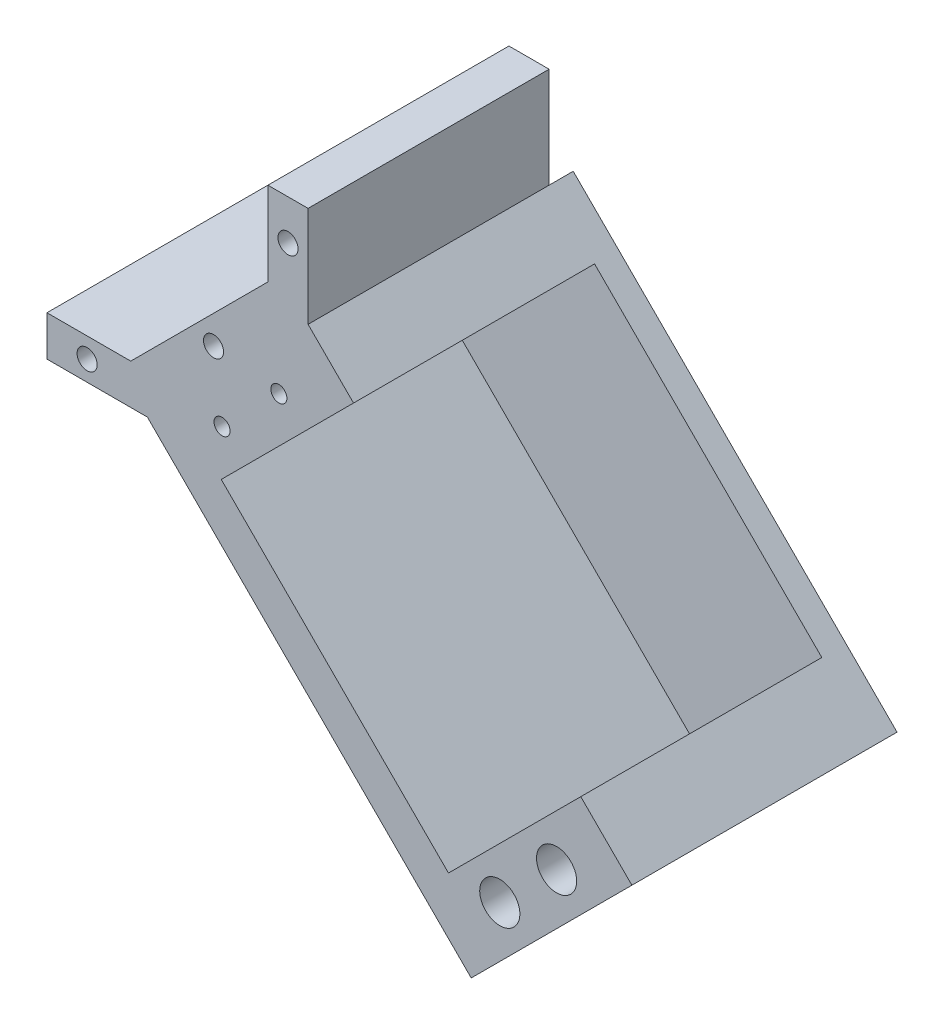
ISO-10303-21;
HEADER;
FILE_DESCRIPTION(('STEP AP214'),'2;1');
FILE_NAME('part.step','',(''),(''),'','','');
FILE_SCHEMA(('AUTOMOTIVE_DESIGN { 1 0 10303 214 1 1 1 1 }'));
ENDSEC;
DATA;
#1=APPLICATION_CONTEXT('core data for automotive mechanical design processes');
#2=APPLICATION_PROTOCOL_DEFINITION('international standard','automotive_design',2000,#1);
#3=PRODUCT_CONTEXT('',#1,'mechanical');
#4=PRODUCT('Part','Part','',(#3));
#5=PRODUCT_RELATED_PRODUCT_CATEGORY('part','',(#4));
#6=PRODUCT_DEFINITION_FORMATION('','',#4);
#7=PRODUCT_DEFINITION_CONTEXT('part definition',#1,'design');
#8=PRODUCT_DEFINITION('design','',#6,#7);
#9=PRODUCT_DEFINITION_SHAPE('','',#8);
#10=(LENGTH_UNIT() NAMED_UNIT(*) SI_UNIT(.MILLI.,.METRE.));
#11=(NAMED_UNIT(*) PLANE_ANGLE_UNIT() SI_UNIT($,.RADIAN.));
#12=(NAMED_UNIT(*) SI_UNIT($,.STERADIAN.) SOLID_ANGLE_UNIT());
#13=UNCERTAINTY_MEASURE_WITH_UNIT(LENGTH_MEASURE(1.E-05),#10,'distance_accuracy_value','');
#14=(GEOMETRIC_REPRESENTATION_CONTEXT(3) GLOBAL_UNCERTAINTY_ASSIGNED_CONTEXT((#13)) GLOBAL_UNIT_ASSIGNED_CONTEXT((#10,
#11,#12)) REPRESENTATION_CONTEXT('',''));
#15=CARTESIAN_POINT('',(0.,0.,0.));
#16=DIRECTION('',(0.,0.,1.));
#17=DIRECTION('',(1.,0.,0.));
#18=AXIS2_PLACEMENT_3D('',#15,#16,#17);
#19=CARTESIAN_POINT('',(0.,0.,0.));
#20=DIRECTION('',(0.,0.,1.));
#21=DIRECTION('',(1.,0.,0.));
#22=AXIS2_PLACEMENT_3D('',#19,#20,#21);
#23=PLANE('',#22);
#24=CARTESIAN_POINT('',(17.6006949622462,12.8343271996086,0.));
#25=DIRECTION('',(0.,0.,1.));
#26=DIRECTION('',(1.,0.,0.));
#27=AXIS2_PLACEMENT_3D('',#24,#25,#26);
#28=CIRCLE('',#27,1.25);
#29=CARTESIAN_POINT('',(18.8506949622462,12.8343271996086,0.));
#30=VERTEX_POINT('',#29);
#31=EDGE_CURVE('E177',#30,#30,#28,.T.);
#32=ORIENTED_EDGE('',*,*,#31,.T.);
#33=EDGE_LOOP('',(#32));
#34=FACE_BOUND('',#33,.T.);
#35=CARTESIAN_POINT('',(42.6006949622462,37.8343271996086,0.));
#36=DIRECTION('',(0.,0.,1.));
#37=DIRECTION('',(1.,0.,0.));
#38=AXIS2_PLACEMENT_3D('',#35,#36,#37);
#39=CIRCLE('',#38,1.25);
#40=CARTESIAN_POINT('',(43.8506949622462,37.8343271996086,0.));
#41=VERTEX_POINT('',#40);
#42=EDGE_CURVE('E174',#41,#41,#39,.T.);
#43=ORIENTED_EDGE('',*,*,#42,.T.);
#44=EDGE_LOOP('',(#43));
#45=FACE_BOUND('',#44,.T.);
#46=CARTESIAN_POINT('',(33.3329280092798,22.102094152575,0.));
#47=DIRECTION('',(0.,0.,1.));
#48=DIRECTION('',(1.,0.,0.));
#49=AXIS2_PLACEMENT_3D('',#46,#47,#48);
#50=CIRCLE('',#49,1.25);
#51=CARTESIAN_POINT('',(34.5829280092798,22.102094152575,0.));
#52=VERTEX_POINT('',#51);
#53=EDGE_CURVE('E171',#52,#52,#50,.T.);
#54=ORIENTED_EDGE('',*,*,#53,.T.);
#55=EDGE_LOOP('',(#54));
#56=FACE_BOUND('',#55,.T.);
#57=DIRECTION('',(0.707106781186548,0.707106781186548,0.));
#58=VECTOR('',#57,1.);
#59=CARTESIAN_POINT('',(45.1006949622462,30.3343271996086,0.));
#60=LINE('',#59,#58);
#61=CARTESIAN_POINT('',(25.1006949622462,10.3343271996086,0.));
#62=VERTEX_POINT('',#61);
#63=CARTESIAN_POINT('',(45.1006949622462,30.3343271996086,0.));
#64=VERTEX_POINT('',#63);
#65=EDGE_CURVE('E91',#62,#64,#60,.T.);
#66=ORIENTED_EDGE('',*,*,#65,.F.);
#67=DIRECTION('',(-1.,0.,0.));
#68=VECTOR('',#67,1.);
#69=CARTESIAN_POINT('',(0.,10.3343271996086,0.));
#70=LINE('',#69,#68);
#71=CARTESIAN_POINT('',(12.6006949622462,10.3343271996086,0.));
#72=VERTEX_POINT('',#71);
#73=EDGE_CURVE('E169',#62,#72,#70,.T.);
#74=ORIENTED_EDGE('',*,*,#73,.T.);
#75=DIRECTION('',(0.,1.,0.));
#76=VECTOR('',#75,1.);
#77=CARTESIAN_POINT('',(12.6006949622461,0.,0.));
#78=LINE('',#77,#76);
#79=CARTESIAN_POINT('',(12.6006949622462,15.3343271996086,0.));
#80=VERTEX_POINT('',#79);
#81=EDGE_CURVE('E121',#72,#80,#78,.T.);
#82=ORIENTED_EDGE('',*,*,#81,.T.);
#83=DIRECTION('',(-1.,0.,0.));
#84=VECTOR('',#83,1.);
#85=CARTESIAN_POINT('',(0.,15.3343271996086,0.));
#86=LINE('',#85,#84);
#87=CARTESIAN_POINT('',(23.0296271503807,15.3343271996086,0.));
#88=VERTEX_POINT('',#87);
#89=EDGE_CURVE('E165',#88,#80,#86,.T.);
#90=ORIENTED_EDGE('',*,*,#89,.F.);
#91=DIRECTION('',(0.707106781186548,0.707106781186547,0.));
#92=VECTOR('',#91,1.);
#93=CARTESIAN_POINT('',(3.84764997538603,-3.84764997538603,0.));
#94=LINE('',#93,#92);
#95=CARTESIAN_POINT('',(40.1006949622462,32.4053950114741,0.));
#96=VERTEX_POINT('',#95);
#97=EDGE_CURVE('E162',#88,#96,#94,.T.);
#98=ORIENTED_EDGE('',*,*,#97,.T.);
#99=DIRECTION('',(0.,-1.,0.));
#100=VECTOR('',#99,1.);
#101=CARTESIAN_POINT('',(40.1006949622462,0.,0.));
#102=LINE('',#101,#100);
#103=CARTESIAN_POINT('',(40.1006949622462,42.8343271996086,0.));
#104=VERTEX_POINT('',#103);
#105=EDGE_CURVE('E159',#104,#96,#102,.T.);
#106=ORIENTED_EDGE('',*,*,#105,.F.);
#107=DIRECTION('',(1.,0.,0.));
#108=VECTOR('',#107,1.);
#109=CARTESIAN_POINT('',(0.,42.8343271996086,0.));
#110=LINE('',#109,#108);
#111=CARTESIAN_POINT('',(45.1006949622462,42.8343271996086,0.));
#112=VERTEX_POINT('',#111);
#113=EDGE_CURVE('E155',#104,#112,#110,.T.);
#114=ORIENTED_EDGE('',*,*,#113,.T.);
#115=DIRECTION('',(0.,-1.,0.));
#116=VECTOR('',#115,1.);
#117=CARTESIAN_POINT('',(45.1006949622462,0.,0.));
#118=LINE('',#117,#116);
#119=EDGE_CURVE('E153',#112,#64,#118,.T.);
#120=ORIENTED_EDGE('',*,*,#119,.T.);
#121=EDGE_LOOP('',(#66,#74,#82,#90,#98,#106,#114,#120));
#122=FACE_BOUND('',#121,.T.);
#123=ADVANCED_FACE('F38',(#34,#45,#56,#122),#23,.F.);
#124=CARTESIAN_POINT('',(37.7175110809274,37.7175110809274,30.));
#125=DIRECTION('',(0.707106781186548,0.707106781186547,0.));
#126=DIRECTION('',(-0.707106781186547,0.707106781186548,0.));
#127=AXIS2_PLACEMENT_3D('',#124,#125,#126);
#128=PLANE('',#127);
#129=DIRECTION('',(0.,0.,-1.));
#130=VECTOR('',#129,1.);
#131=CARTESIAN_POINT('',(50.7575492117385,24.6774729501163,30.));
#132=LINE('',#131,#130);
#133=CARTESIAN_POINT('',(50.7575492117385,24.6774729501163,30.));
#134=VERTEX_POINT('',#133);
#135=CARTESIAN_POINT('',(50.7575492117385,24.6774729501163,0.));
#136=VERTEX_POINT('',#135);
#137=EDGE_CURVE('E152',#134,#136,#132,.T.);
#138=ORIENTED_EDGE('',*,*,#137,.T.);
#139=DIRECTION('',(0.707106781186547,-0.707106781186548,0.));
#140=VECTOR('',#139,1.);
#141=CARTESIAN_POINT('',(79.0418204592004,-3.60679829734566,0.));
#142=LINE('',#141,#140);
#143=CARTESIAN_POINT('',(79.0418204592004,-3.60679829734566,0.));
#144=VERTEX_POINT('',#143);
#145=EDGE_CURVE('E282',#136,#144,#142,.T.);
#146=ORIENTED_EDGE('',*,*,#145,.T.);
#147=DIRECTION('',(0.,0.,-1.));
#148=VECTOR('',#147,1.);
#149=CARTESIAN_POINT('',(79.0418204592004,-3.60679829734566,30.));
#150=LINE('',#149,#148);
#151=CARTESIAN_POINT('',(79.0418204592004,-3.60679829734566,30.));
#152=VERTEX_POINT('',#151);
#153=EDGE_CURVE('E264',#152,#144,#150,.T.);
#154=ORIENTED_EDGE('',*,*,#153,.F.);
#155=DIRECTION('',(0.707106781186548,-0.707106781186547,0.));
#156=VECTOR('',#155,1.);
#157=CARTESIAN_POINT('',(85.4057814898793,-9.97075932802457,30.));
#158=LINE('',#157,#156);
#159=CARTESIAN_POINT('',(85.4057814898793,-9.97075932802457,30.));
#160=VERTEX_POINT('',#159);
#161=EDGE_CURVE('E252',#152,#160,#158,.T.);
#162=ORIENTED_EDGE('',*,*,#161,.T.);
#163=DIRECTION('',(0.,0.,-1.));
#164=VECTOR('',#163,1.);
#165=CARTESIAN_POINT('',(85.4057814898793,-9.97075932802457,30.));
#166=LINE('',#165,#164);
#167=CARTESIAN_POINT('',(85.4057814898793,-9.97075932802457,-3.));
#168=VERTEX_POINT('',#167);
#169=EDGE_CURVE('E261',#160,#168,#166,.T.);
#170=ORIENTED_EDGE('',*,*,#169,.T.);
#171=DIRECTION('',(0.707106781186547,-0.707106781186547,0.));
#172=VECTOR('',#171,1.);
#173=CARTESIAN_POINT('',(45.1006949622462,30.3343271996086,-3.));
#174=LINE('',#173,#172);
#175=CARTESIAN_POINT('',(45.1006949622462,30.3343271996086,-3.));
#176=VERTEX_POINT('',#175);
#177=EDGE_CURVE('E313',#176,#168,#174,.T.);
#178=ORIENTED_EDGE('',*,*,#177,.F.);
#179=DIRECTION('',(0.,0.,1.));
#180=VECTOR('',#179,1.);
#181=CARTESIAN_POINT('',(45.1006949622462,30.3343271996086,-3.));
#182=LINE('',#181,#180);
#183=EDGE_CURVE('E236',#176,#64,#182,.T.);
#184=ORIENTED_EDGE('',*,*,#183,.T.);
#185=DIRECTION('',(0.,0.,-1.));
#186=VECTOR('',#185,1.);
#187=CARTESIAN_POINT('',(45.1006949622462,30.3343271996086,30.));
#188=LINE('',#187,#186);
#189=CARTESIAN_POINT('',(45.1006949622462,30.3343271996086,30.));
#190=VERTEX_POINT('',#189);
#191=EDGE_CURVE('E11',#190,#64,#188,.T.);
#192=ORIENTED_EDGE('',*,*,#191,.F.);
#193=DIRECTION('',(0.707106781186547,-0.707106781186548,0.));
#194=VECTOR('',#193,1.);
#195=CARTESIAN_POINT('',(37.7175110809274,37.7175110809274,30.));
#196=LINE('',#195,#194);
#197=EDGE_CURVE('E215',#190,#134,#196,.T.);
#198=ORIENTED_EDGE('',*,*,#197,.T.);
#199=EDGE_LOOP('',(#138,#146,#154,#162,#170,#178,#184,#192,#198));
#200=FACE_BOUND('',#199,.T.);
#201=ADVANCED_FACE('F276',(#200),#128,.T.);
#202=CARTESIAN_POINT('',(45.1006949622462,0.,30.));
#203=DIRECTION('',(1.,0.,0.));
#204=DIRECTION('',(0.,0.,-1.));
#205=AXIS2_PLACEMENT_3D('',#202,#203,#204);
#206=PLANE('',#205);
#207=ORIENTED_EDGE('',*,*,#119,.F.);
#208=DIRECTION('',(0.,0.,-1.));
#209=VECTOR('',#208,1.);
#210=CARTESIAN_POINT('',(45.1006949622462,42.8343271996086,30.));
#211=LINE('',#210,#209);
#212=CARTESIAN_POINT('',(45.1006949622462,42.8343271996086,30.));
#213=VERTEX_POINT('',#212);
#214=EDGE_CURVE('E47',#213,#112,#211,.T.);
#215=ORIENTED_EDGE('',*,*,#214,.F.);
#216=DIRECTION('',(0.,-1.,0.));
#217=VECTOR('',#216,1.);
#218=CARTESIAN_POINT('',(45.1006949622462,0.,30.));
#219=LINE('',#218,#217);
#220=EDGE_CURVE('E213',#213,#190,#219,.T.);
#221=ORIENTED_EDGE('',*,*,#220,.T.);
#222=ORIENTED_EDGE('',*,*,#191,.T.);
#223=EDGE_LOOP('',(#207,#215,#221,#222));
#224=FACE_BOUND('',#223,.T.);
#225=ADVANCED_FACE('F200',(#224),#206,.T.);
#226=CARTESIAN_POINT('',(0.,42.8343271996086,30.));
#227=DIRECTION('',(0.,1.,0.));
#228=DIRECTION('',(0.,0.,1.));
#229=AXIS2_PLACEMENT_3D('',#226,#227,#228);
#230=PLANE('',#229);
#231=ORIENTED_EDGE('',*,*,#113,.F.);
#232=DIRECTION('',(0.,0.,-1.));
#233=VECTOR('',#232,1.);
#234=CARTESIAN_POINT('',(40.1006949622462,42.8343271996086,30.));
#235=LINE('',#234,#233);
#236=CARTESIAN_POINT('',(40.1006949622462,42.8343271996086,30.));
#237=VERTEX_POINT('',#236);
#238=EDGE_CURVE('E189',#237,#104,#235,.T.);
#239=ORIENTED_EDGE('',*,*,#238,.F.);
#240=DIRECTION('',(1.,0.,0.));
#241=VECTOR('',#240,1.);
#242=CARTESIAN_POINT('',(0.,42.8343271996086,30.));
#243=LINE('',#242,#241);
#244=EDGE_CURVE('E196',#237,#213,#243,.T.);
#245=ORIENTED_EDGE('',*,*,#244,.T.);
#246=ORIENTED_EDGE('',*,*,#214,.T.);
#247=EDGE_LOOP('',(#231,#239,#245,#246));
#248=FACE_BOUND('',#247,.T.);
#249=ADVANCED_FACE('F194',(#248),#230,.T.);
#250=CARTESIAN_POINT('',(40.1006949622462,0.,30.));
#251=DIRECTION('',(1.,0.,0.));
#252=DIRECTION('',(0.,0.,-1.));
#253=AXIS2_PLACEMENT_3D('',#250,#251,#252);
#254=PLANE('',#253);
#255=ORIENTED_EDGE('',*,*,#105,.T.);
#256=DIRECTION('',(0.,0.,-1.));
#257=VECTOR('',#256,1.);
#258=CARTESIAN_POINT('',(40.1006949622462,32.4053950114741,30.));
#259=LINE('',#258,#257);
#260=CARTESIAN_POINT('',(40.1006949622462,32.4053950114741,30.));
#261=VERTEX_POINT('',#260);
#262=EDGE_CURVE('E187',#261,#96,#259,.T.);
#263=ORIENTED_EDGE('',*,*,#262,.F.);
#264=DIRECTION('',(0.,-1.,0.));
#265=VECTOR('',#264,1.);
#266=CARTESIAN_POINT('',(40.1006949622462,0.,30.));
#267=LINE('',#266,#265);
#268=EDGE_CURVE('E210',#237,#261,#267,.T.);
#269=ORIENTED_EDGE('',*,*,#268,.F.);
#270=ORIENTED_EDGE('',*,*,#238,.T.);
#271=EDGE_LOOP('',(#255,#263,#269,#270));
#272=FACE_BOUND('',#271,.T.);
#273=ADVANCED_FACE('F207',(#272),#254,.F.);
#274=CARTESIAN_POINT('',(3.84764997538603,-3.84764997538603,30.));
#275=DIRECTION('',(-0.707106781186547,0.707106781186548,0.));
#276=DIRECTION('',(-0.707106781186548,-0.707106781186547,0.));
#277=AXIS2_PLACEMENT_3D('',#274,#275,#276);
#278=PLANE('',#277);
#279=ORIENTED_EDGE('',*,*,#97,.F.);
#280=DIRECTION('',(0.,0.,-1.));
#281=VECTOR('',#280,1.);
#282=CARTESIAN_POINT('',(23.0296271503807,15.3343271996086,30.));
#283=LINE('',#282,#281);
#284=CARTESIAN_POINT('',(23.0296271503807,15.3343271996086,30.));
#285=VERTEX_POINT('',#284);
#286=EDGE_CURVE('E185',#285,#88,#283,.T.);
#287=ORIENTED_EDGE('',*,*,#286,.F.);
#288=DIRECTION('',(0.707106781186548,0.707106781186547,0.));
#289=VECTOR('',#288,1.);
#290=CARTESIAN_POINT('',(3.84764997538603,-3.84764997538603,30.));
#291=LINE('',#290,#289);
#292=EDGE_CURVE('E211',#285,#261,#291,.T.);
#293=ORIENTED_EDGE('',*,*,#292,.T.);
#294=ORIENTED_EDGE('',*,*,#262,.T.);
#295=EDGE_LOOP('',(#279,#287,#293,#294));
#296=FACE_BOUND('',#295,.T.);
#297=ADVANCED_FACE('F220',(#296),#278,.T.);
#298=CARTESIAN_POINT('',(0.,15.3343271996086,30.));
#299=DIRECTION('',(0.,-1.,0.));
#300=DIRECTION('',(1.,0.,0.));
#301=AXIS2_PLACEMENT_3D('',#298,#299,#300);
#302=PLANE('',#301);
#303=ORIENTED_EDGE('',*,*,#89,.T.);
#304=DIRECTION('',(0.,0.,-1.));
#305=VECTOR('',#304,1.);
#306=CARTESIAN_POINT('',(12.6006949622462,15.3343271996086,30.));
#307=LINE('',#306,#305);
#308=CARTESIAN_POINT('',(12.6006949622462,15.3343271996086,30.));
#309=VERTEX_POINT('',#308);
#310=EDGE_CURVE('E122',#309,#80,#307,.T.);
#311=ORIENTED_EDGE('',*,*,#310,.F.);
#312=DIRECTION('',(-1.,0.,0.));
#313=VECTOR('',#312,1.);
#314=CARTESIAN_POINT('',(0.,15.3343271996086,30.));
#315=LINE('',#314,#313);
#316=EDGE_CURVE('E132',#285,#309,#315,.T.);
#317=ORIENTED_EDGE('',*,*,#316,.F.);
#318=ORIENTED_EDGE('',*,*,#286,.T.);
#319=EDGE_LOOP('',(#303,#311,#317,#318));
#320=FACE_BOUND('',#319,.T.);
#321=ADVANCED_FACE('F222',(#320),#302,.F.);
#322=CARTESIAN_POINT('',(12.6006949622461,0.,30.));
#323=DIRECTION('',(-1.,0.,0.));
#324=DIRECTION('',(0.,-1.,0.));
#325=AXIS2_PLACEMENT_3D('',#322,#323,#324);
#326=PLANE('',#325);
#327=ORIENTED_EDGE('',*,*,#81,.F.);
#328=DIRECTION('',(0.,0.,-1.));
#329=VECTOR('',#328,1.);
#330=CARTESIAN_POINT('',(12.6006949622462,10.3343271996086,30.));
#331=LINE('',#330,#329);
#332=CARTESIAN_POINT('',(12.6006949622462,10.3343271996086,30.));
#333=VERTEX_POINT('',#332);
#334=EDGE_CURVE('E83',#333,#72,#331,.T.);
#335=ORIENTED_EDGE('',*,*,#334,.F.);
#336=DIRECTION('',(0.,1.,0.));
#337=VECTOR('',#336,1.);
#338=CARTESIAN_POINT('',(12.6006949622461,0.,30.));
#339=LINE('',#338,#337);
#340=EDGE_CURVE('E119',#333,#309,#339,.T.);
#341=ORIENTED_EDGE('',*,*,#340,.T.);
#342=ORIENTED_EDGE('',*,*,#310,.T.);
#343=EDGE_LOOP('',(#327,#335,#341,#342));
#344=FACE_BOUND('',#343,.T.);
#345=ADVANCED_FACE('F118',(#344),#326,.T.);
#346=CARTESIAN_POINT('',(0.,10.3343271996086,30.));
#347=DIRECTION('',(0.,-1.,0.));
#348=DIRECTION('',(0.,0.,-1.));
#349=AXIS2_PLACEMENT_3D('',#346,#347,#348);
#350=PLANE('',#349);
#351=ORIENTED_EDGE('',*,*,#73,.F.);
#352=DIRECTION('',(0.,0.,-1.));
#353=VECTOR('',#352,1.);
#354=CARTESIAN_POINT('',(25.1006949622462,10.3343271996086,30.));
#355=LINE('',#354,#353);
#356=CARTESIAN_POINT('',(25.1006949622462,10.3343271996086,30.));
#357=VERTEX_POINT('',#356);
#358=EDGE_CURVE('E123',#357,#62,#355,.T.);
#359=ORIENTED_EDGE('',*,*,#358,.F.);
#360=DIRECTION('',(-1.,0.,0.));
#361=VECTOR('',#360,1.);
#362=CARTESIAN_POINT('',(0.,10.3343271996086,30.));
#363=LINE('',#362,#361);
#364=EDGE_CURVE('E129',#357,#333,#363,.T.);
#365=ORIENTED_EDGE('',*,*,#364,.T.);
#366=ORIENTED_EDGE('',*,*,#334,.T.);
#367=EDGE_LOOP('',(#351,#359,#365,#366));
#368=FACE_BOUND('',#367,.T.);
#369=ADVANCED_FACE('F135',(#368),#350,.T.);
#370=CARTESIAN_POINT('',(17.7175110809275,17.7175110809274,30.));
#371=DIRECTION('',(0.70710678118655,0.707106781186545,0.));
#372=DIRECTION('',(-0.707106781186545,0.70710678118655,0.));
#373=AXIS2_PLACEMENT_3D('',#370,#371,#372);
#374=PLANE('',#373);
#375=ORIENTED_EDGE('',*,*,#358,.T.);
#376=DIRECTION('',(0.,0.,1.));
#377=VECTOR('',#376,1.);
#378=CARTESIAN_POINT('',(25.1006949622462,10.3343271996086,-3.));
#379=LINE('',#378,#377);
#380=CARTESIAN_POINT('',(25.1006949622462,10.3343271996086,-3.));
#381=VERTEX_POINT('',#380);
#382=EDGE_CURVE('E227',#381,#62,#379,.T.);
#383=ORIENTED_EDGE('',*,*,#382,.F.);
#384=DIRECTION('',(-0.707106781186547,0.707106781186548,0.));
#385=VECTOR('',#384,1.);
#386=CARTESIAN_POINT('',(65.4057814898793,-29.9707593280246,-3.));
#387=LINE('',#386,#385);
#388=CARTESIAN_POINT('',(65.4057814898793,-29.9707593280246,-3.));
#389=VERTEX_POINT('',#388);
#390=EDGE_CURVE('E319',#389,#381,#387,.T.);
#391=ORIENTED_EDGE('',*,*,#390,.F.);
#392=DIRECTION('',(0.,0.,-1.));
#393=VECTOR('',#392,1.);
#394=CARTESIAN_POINT('',(65.4057814898793,-29.9707593280246,30.));
#395=LINE('',#394,#393);
#396=CARTESIAN_POINT('',(65.4057814898793,-29.9707593280246,30.));
#397=VERTEX_POINT('',#396);
#398=EDGE_CURVE('E156',#397,#389,#395,.T.);
#399=ORIENTED_EDGE('',*,*,#398,.F.);
#400=DIRECTION('',(0.707106781186545,-0.70710678118655,0.));
#401=VECTOR('',#400,1.);
#402=CARTESIAN_POINT('',(17.7175110809275,17.7175110809274,30.));
#403=LINE('',#402,#401);
#404=EDGE_CURVE('E137',#357,#397,#403,.T.);
#405=ORIENTED_EDGE('',*,*,#404,.F.);
#406=EDGE_LOOP('',(#375,#383,#391,#399,#405));
#407=FACE_BOUND('',#406,.T.);
#408=ADVANCED_FACE('F340',(#407),#374,.F.);
#409=CARTESIAN_POINT('',(42.6006949622462,37.8343271996086,30.));
#410=DIRECTION('',(0.,0.,-1.));
#411=DIRECTION('',(-1.,0.,0.));
#412=AXIS2_PLACEMENT_3D('',#409,#410,#411);
#413=CYLINDRICAL_SURFACE('',#412,1.25);
#414=CARTESIAN_POINT('',(42.6006949622462,37.8343271996086,30.));
#415=DIRECTION('',(0.,0.,1.));
#416=DIRECTION('',(1.,0.,0.));
#417=AXIS2_PLACEMENT_3D('',#414,#415,#416);
#418=CIRCLE('',#417,1.25);
#419=CARTESIAN_POINT('',(43.8506949622462,37.8343271996086,30.));
#420=VERTEX_POINT('',#419);
#421=EDGE_CURVE('E146',#420,#420,#418,.T.);
#422=ORIENTED_EDGE('',*,*,#421,.T.);
#423=EDGE_LOOP('',(#422));
#424=FACE_BOUND('',#423,.T.);
#425=ORIENTED_EDGE('',*,*,#42,.F.);
#426=EDGE_LOOP('',(#425));
#427=FACE_BOUND('',#426,.T.);
#428=ADVANCED_FACE('F387',(#424,#427),#413,.F.);
#429=CARTESIAN_POINT('',(33.3329280092798,22.102094152575,30.));
#430=DIRECTION('',(0.,0.,-1.));
#431=DIRECTION('',(-1.,0.,0.));
#432=AXIS2_PLACEMENT_3D('',#429,#430,#431);
#433=CYLINDRICAL_SURFACE('',#432,1.25);
#434=CARTESIAN_POINT('',(33.3329280092798,22.102094152575,30.));
#435=DIRECTION('',(0.,0.,1.));
#436=DIRECTION('',(1.,0.,0.));
#437=AXIS2_PLACEMENT_3D('',#434,#435,#436);
#438=CIRCLE('',#437,1.25);
#439=CARTESIAN_POINT('',(34.5829280092798,22.102094152575,30.));
#440=VERTEX_POINT('',#439);
#441=EDGE_CURVE('E143',#440,#440,#438,.T.);
#442=ORIENTED_EDGE('',*,*,#441,.T.);
#443=EDGE_LOOP('',(#442));
#444=FACE_BOUND('',#443,.T.);
#445=ORIENTED_EDGE('',*,*,#53,.F.);
#446=EDGE_LOOP('',(#445));
#447=FACE_BOUND('',#446,.T.);
#448=ADVANCED_FACE('F390',(#444,#447),#433,.F.);
#449=CARTESIAN_POINT('',(13.0400381308111,-13.0400381308111,30.));
#450=DIRECTION('',(-0.707106781186547,0.707106781186548,0.));
#451=DIRECTION('',(-0.707106781186548,-0.707106781186547,0.));
#452=AXIS2_PLACEMENT_3D('',#449,#450,#451);
#453=PLANE('',#452);
#454=DIRECTION('',(0.,0.,-1.));
#455=VECTOR('',#454,1.);
#456=CARTESIAN_POINT('',(34.2930831176712,8.213006856049,30.));
#457=LINE('',#456,#455);
#458=CARTESIAN_POINT('',(34.2930831176712,8.213006856049,30.));
#459=VERTEX_POINT('',#458);
#460=CARTESIAN_POINT('',(34.2930831176712,8.213006856049,0.));
#461=VERTEX_POINT('',#460);
#462=EDGE_CURVE('E258',#459,#461,#457,.T.);
#463=ORIENTED_EDGE('',*,*,#462,.T.);
#464=DIRECTION('',(0.707106781186548,0.707106781186547,0.));
#465=VECTOR('',#464,1.);
#466=CARTESIAN_POINT('',(50.7575492117385,24.6774729501163,0.));
#467=LINE('',#466,#465);
#468=EDGE_CURVE('E290',#461,#136,#467,.T.);
#469=ORIENTED_EDGE('',*,*,#468,.T.);
#470=ORIENTED_EDGE('',*,*,#137,.F.);
#471=DIRECTION('',(0.707106781186548,0.707106781186547,0.));
#472=VECTOR('',#471,1.);
#473=CARTESIAN_POINT('',(13.0400381308111,-13.0400381308111,30.));
#474=LINE('',#473,#472);
#475=EDGE_CURVE('E55',#459,#134,#474,.T.);
#476=ORIENTED_EDGE('',*,*,#475,.F.);
#477=EDGE_LOOP('',(#463,#469,#470,#476));
#478=FACE_BOUND('',#477,.T.);
#479=ADVANCED_FACE('F287',(#478),#453,.F.);
#480=CARTESIAN_POINT('',(34.3935881810596,13.9703661689297,30.));
#481=DIRECTION('',(0.,0.,-1.));
#482=DIRECTION('',(-1.,0.,0.));
#483=AXIS2_PLACEMENT_3D('',#480,#481,#482);
#484=CYLINDRICAL_SURFACE('',#483,1.);
#485=CARTESIAN_POINT('',(34.3935881810596,13.9703661689297,30.));
#486=DIRECTION('',(0.,0.,1.));
#487=DIRECTION('',(1.,0.,0.));
#488=AXIS2_PLACEMENT_3D('',#485,#486,#487);
#489=CIRCLE('',#488,1.);
#490=CARTESIAN_POINT('',(35.3935881810596,13.9703661689297,30.));
#491=VERTEX_POINT('',#490);
#492=EDGE_CURVE('E274',#491,#491,#489,.T.);
#493=ORIENTED_EDGE('',*,*,#492,.T.);
#494=EDGE_LOOP('',(#493));
#495=FACE_BOUND('',#494,.T.);
#496=CARTESIAN_POINT('',(34.3935881810596,13.9703661689297,-3.));
#497=DIRECTION('',(0.,0.,-1.));
#498=DIRECTION('',(-1.,0.,0.));
#499=AXIS2_PLACEMENT_3D('',#496,#497,#498);
#500=CIRCLE('',#499,0.999999999999998);
#501=CARTESIAN_POINT('',(33.3935881810596,13.9703661689297,-3.));
#502=VERTEX_POINT('',#501);
#503=EDGE_CURVE('E299',#502,#502,#500,.T.);
#504=ORIENTED_EDGE('',*,*,#503,.T.);
#505=EDGE_LOOP('',(#504));
#506=FACE_BOUND('',#505,.T.);
#507=ADVANCED_FACE('F397',(#495,#506),#484,.F.);
#508=CARTESIAN_POINT('',(41.4646559929251,21.0414339807952,30.));
#509=DIRECTION('',(0.,0.,-1.));
#510=DIRECTION('',(-1.,0.,0.));
#511=AXIS2_PLACEMENT_3D('',#508,#509,#510);
#512=CYLINDRICAL_SURFACE('',#511,1.);
#513=CARTESIAN_POINT('',(41.4646559929251,21.0414339807952,30.));
#514=DIRECTION('',(0.,0.,1.));
#515=DIRECTION('',(1.,0.,0.));
#516=AXIS2_PLACEMENT_3D('',#513,#514,#515);
#517=CIRCLE('',#516,1.);
#518=CARTESIAN_POINT('',(42.4646559929251,21.0414339807952,30.));
#519=VERTEX_POINT('',#518);
#520=EDGE_CURVE('E180',#519,#519,#517,.T.);
#521=ORIENTED_EDGE('',*,*,#520,.T.);
#522=EDGE_LOOP('',(#521));
#523=FACE_BOUND('',#522,.T.);
#524=CARTESIAN_POINT('',(41.4646559929251,21.0414339807952,-3.));
#525=DIRECTION('',(0.,0.,-1.));
#526=DIRECTION('',(-1.,0.,0.));
#527=AXIS2_PLACEMENT_3D('',#524,#525,#526);
#528=CIRCLE('',#527,0.999999999999998);
#529=CARTESIAN_POINT('',(40.4646559929251,21.0414339807952,-3.));
#530=VERTEX_POINT('',#529);
#531=EDGE_CURVE('E295',#530,#530,#528,.T.);
#532=ORIENTED_EDGE('',*,*,#531,.T.);
#533=EDGE_LOOP('',(#532));
#534=FACE_BOUND('',#533,.T.);
#535=ADVANCED_FACE('F40',(#523,#534),#512,.F.);
#536=CARTESIAN_POINT('',(17.6006949622462,12.8343271996086,30.));
#537=DIRECTION('',(0.,0.,-1.));
#538=DIRECTION('',(-1.,0.,0.));
#539=AXIS2_PLACEMENT_3D('',#536,#537,#538);
#540=CYLINDRICAL_SURFACE('',#539,1.25);
#541=CARTESIAN_POINT('',(17.6006949622462,12.8343271996086,30.));
#542=DIRECTION('',(0.,0.,1.));
#543=DIRECTION('',(1.,0.,0.));
#544=AXIS2_PLACEMENT_3D('',#541,#542,#543);
#545=CIRCLE('',#544,1.25);
#546=CARTESIAN_POINT('',(18.8506949622462,12.8343271996086,30.));
#547=VERTEX_POINT('',#546);
#548=EDGE_CURVE('E149',#547,#547,#545,.T.);
#549=ORIENTED_EDGE('',*,*,#548,.T.);
#550=EDGE_LOOP('',(#549));
#551=FACE_BOUND('',#550,.T.);
#552=ORIENTED_EDGE('',*,*,#31,.F.);
#553=EDGE_LOOP('',(#552));
#554=FACE_BOUND('',#553,.T.);
#555=ADVANCED_FACE('F383',(#551,#554),#540,.F.);
#556=CARTESIAN_POINT('',(0.,0.,30.));
#557=DIRECTION('',(0.,0.,1.));
#558=DIRECTION('',(1.,0.,0.));
#559=AXIS2_PLACEMENT_3D('',#556,#557,#558);
#560=PLANE('',#559);
#561=ORIENTED_EDGE('',*,*,#520,.F.);
#562=EDGE_LOOP('',(#561));
#563=FACE_BOUND('',#562,.T.);
#564=ORIENTED_EDGE('',*,*,#492,.F.);
#565=EDGE_LOOP('',(#564));
#566=FACE_BOUND('',#565,.T.);
#567=ORIENTED_EDGE('',*,*,#197,.F.);
#568=ORIENTED_EDGE('',*,*,#220,.F.);
#569=ORIENTED_EDGE('',*,*,#244,.F.);
#570=ORIENTED_EDGE('',*,*,#268,.T.);
#571=ORIENTED_EDGE('',*,*,#292,.F.);
#572=ORIENTED_EDGE('',*,*,#316,.T.);
#573=ORIENTED_EDGE('',*,*,#340,.F.);
#574=ORIENTED_EDGE('',*,*,#364,.F.);
#575=ORIENTED_EDGE('',*,*,#404,.T.);
#576=DIRECTION('',(-0.707106781186547,-0.707106781186547,0.));
#577=VECTOR('',#576,1.);
#578=CARTESIAN_POINT('',(65.4057814898793,-29.9707593280246,30.));
#579=LINE('',#578,#577);
#580=EDGE_CURVE('E255',#160,#397,#579,.T.);
#581=ORIENTED_EDGE('',*,*,#580,.F.);
#582=ORIENTED_EDGE('',*,*,#161,.F.);
#583=DIRECTION('',(0.707106781186548,0.707106781186547,0.));
#584=VECTOR('',#583,1.);
#585=CARTESIAN_POINT('',(62.5773543651331,-20.0712643914129,30.));
#586=LINE('',#585,#584);
#587=CARTESIAN_POINT('',(62.5773543651331,-20.0712643914129,30.));
#588=VERTEX_POINT('',#587);
#589=EDGE_CURVE('E249',#588,#152,#586,.T.);
#590=ORIENTED_EDGE('',*,*,#589,.F.);
#591=DIRECTION('',(0.707106781186548,-0.707106781186548,0.));
#592=VECTOR('',#591,1.);
#593=CARTESIAN_POINT('',(34.2930831176712,8.213006856049,30.));
#594=LINE('',#593,#592);
#595=EDGE_CURVE('E246',#459,#588,#594,.T.);
#596=ORIENTED_EDGE('',*,*,#595,.F.);
#597=ORIENTED_EDGE('',*,*,#475,.T.);
#598=EDGE_LOOP('',(#567,#568,#569,#570,#571,#572,#573,#574,#575,#581,#582,#590,#596,#597));
#599=FACE_BOUND('',#598,.T.);
#600=ORIENTED_EDGE('',*,*,#441,.F.);
#601=EDGE_LOOP('',(#600));
#602=FACE_BOUND('',#601,.T.);
#603=ORIENTED_EDGE('',*,*,#421,.F.);
#604=EDGE_LOOP('',(#603));
#605=FACE_BOUND('',#604,.T.);
#606=ORIENTED_EDGE('',*,*,#548,.F.);
#607=EDGE_LOOP('',(#606));
#608=FACE_BOUND('',#607,.T.);
#609=CARTESIAN_POINT('',(68.9620019799896,-20.0505778072353,30.));
#610=DIRECTION('',(0.,0.,-1.));
#611=DIRECTION('',(-1.,0.,0.));
#612=AXIS2_PLACEMENT_3D('',#609,#610,#611);
#613=CIRCLE('',#612,2.5);
#614=CARTESIAN_POINT('',(66.4620019799896,-20.0505778072353,30.));
#615=VERTEX_POINT('',#614);
#616=EDGE_CURVE('E235',#615,#615,#613,.T.);
#617=ORIENTED_EDGE('',*,*,#616,.T.);
#618=EDGE_LOOP('',(#617));
#619=FACE_BOUND('',#618,.T.);
#620=CARTESIAN_POINT('',(76.0330697918551,-12.9795099953699,30.));
#621=DIRECTION('',(0.,0.,-1.));
#622=DIRECTION('',(-1.,0.,0.));
#623=AXIS2_PLACEMENT_3D('',#620,#621,#622);
#624=CIRCLE('',#623,2.50000000000001);
#625=CARTESIAN_POINT('',(73.5330697918551,-12.9795099953699,30.));
#626=VERTEX_POINT('',#625);
#627=EDGE_CURVE('E239',#626,#626,#624,.T.);
#628=ORIENTED_EDGE('',*,*,#627,.T.);
#629=EDGE_LOOP('',(#628));
#630=FACE_BOUND('',#629,.T.);
#631=ADVANCED_FACE('F126',(#563,#566,#599,#602,#605,#608,#619,#630),#560,.T.);
#632=CARTESIAN_POINT('',(65.4057814898793,-29.9707593280246,30.));
#633=DIRECTION('',(0.707106781186547,-0.707106781186547,0.));
#634=DIRECTION('',(0.707106781186548,0.707106781186548,0.));
#635=AXIS2_PLACEMENT_3D('',#632,#633,#634);
#636=PLANE('',#635);
#637=ORIENTED_EDGE('',*,*,#398,.T.);
#638=DIRECTION('',(-0.707106781186547,-0.707106781186547,0.));
#639=VECTOR('',#638,1.);
#640=CARTESIAN_POINT('',(85.4057814898793,-9.97075932802457,-3.));
#641=LINE('',#640,#639);
#642=EDGE_CURVE('E316',#168,#389,#641,.T.);
#643=ORIENTED_EDGE('',*,*,#642,.F.);
#644=ORIENTED_EDGE('',*,*,#169,.F.);
#645=ORIENTED_EDGE('',*,*,#580,.T.);
#646=EDGE_LOOP('',(#637,#643,#644,#645));
#647=FACE_BOUND('',#646,.T.);
#648=ADVANCED_FACE('F337',(#647),#636,.T.);
#649=CARTESIAN_POINT('',(62.5773543651331,-20.0712643914129,30.));
#650=DIRECTION('',(-0.707106781186547,0.707106781186548,0.));
#651=DIRECTION('',(-0.707106781186548,-0.707106781186547,0.));
#652=AXIS2_PLACEMENT_3D('',#649,#650,#651);
#653=PLANE('',#652);
#654=DIRECTION('',(-0.707106781186548,-0.707106781186547,0.));
#655=VECTOR('',#654,1.);
#656=CARTESIAN_POINT('',(62.5773543651331,-20.0712643914129,0.));
#657=LINE('',#656,#655);
#658=CARTESIAN_POINT('',(62.5773543651331,-20.0712643914129,0.));
#659=VERTEX_POINT('',#658);
#660=EDGE_CURVE('E301',#144,#659,#657,.T.);
#661=ORIENTED_EDGE('',*,*,#660,.T.);
#662=DIRECTION('',(0.,0.,-1.));
#663=VECTOR('',#662,1.);
#664=CARTESIAN_POINT('',(62.5773543651331,-20.0712643914129,30.));
#665=LINE('',#664,#663);
#666=EDGE_CURVE('E267',#588,#659,#665,.T.);
#667=ORIENTED_EDGE('',*,*,#666,.F.);
#668=ORIENTED_EDGE('',*,*,#589,.T.);
#669=ORIENTED_EDGE('',*,*,#153,.T.);
#670=EDGE_LOOP('',(#661,#667,#668,#669));
#671=FACE_BOUND('',#670,.T.);
#672=ADVANCED_FACE('F359',(#671),#653,.T.);
#673=CARTESIAN_POINT('',(34.2930831176712,8.213006856049,30.));
#674=DIRECTION('',(0.707106781186547,0.707106781186547,0.));
#675=DIRECTION('',(-0.707106781186548,0.707106781186548,0.));
#676=AXIS2_PLACEMENT_3D('',#673,#674,#675);
#677=PLANE('',#676);
#678=DIRECTION('',(-0.707106781186548,0.707106781186547,0.));
#679=VECTOR('',#678,1.);
#680=CARTESIAN_POINT('',(34.2930831176712,8.213006856049,0.));
#681=LINE('',#680,#679);
#682=EDGE_CURVE('E296',#659,#461,#681,.T.);
#683=ORIENTED_EDGE('',*,*,#682,.T.);
#684=ORIENTED_EDGE('',*,*,#462,.F.);
#685=ORIENTED_EDGE('',*,*,#595,.T.);
#686=ORIENTED_EDGE('',*,*,#666,.T.);
#687=EDGE_LOOP('',(#683,#684,#685,#686));
#688=FACE_BOUND('',#687,.T.);
#689=ADVANCED_FACE('F361',(#688),#677,.T.);
#690=CARTESIAN_POINT('',(76.0330697918551,-12.9795099953699,30.));
#691=DIRECTION('',(0.,0.,-1.));
#692=DIRECTION('',(-1.,0.,0.));
#693=AXIS2_PLACEMENT_3D('',#690,#691,#692);
#694=CYLINDRICAL_SURFACE('',#693,2.50000000000001);
#695=ORIENTED_EDGE('',*,*,#627,.F.);
#696=EDGE_LOOP('',(#695));
#697=FACE_BOUND('',#696,.T.);
#698=CARTESIAN_POINT('',(76.0330697918551,-12.9795099953699,-3.));
#699=DIRECTION('',(0.,0.,-1.));
#700=DIRECTION('',(-1.,0.,0.));
#701=AXIS2_PLACEMENT_3D('',#698,#699,#700);
#702=CIRCLE('',#701,2.50000000000001);
#703=CARTESIAN_POINT('',(73.5330697918551,-12.9795099953699,-3.));
#704=VERTEX_POINT('',#703);
#705=EDGE_CURVE('E307',#704,#704,#702,.T.);
#706=ORIENTED_EDGE('',*,*,#705,.T.);
#707=EDGE_LOOP('',(#706));
#708=FACE_BOUND('',#707,.T.);
#709=ADVANCED_FACE('F363',(#697,#708),#694,.F.);
#710=CARTESIAN_POINT('',(68.9620019799896,-20.0505778072353,30.));
#711=DIRECTION('',(0.,0.,-1.));
#712=DIRECTION('',(-1.,0.,0.));
#713=AXIS2_PLACEMENT_3D('',#710,#711,#712);
#714=CYLINDRICAL_SURFACE('',#713,2.5);
#715=ORIENTED_EDGE('',*,*,#616,.F.);
#716=EDGE_LOOP('',(#715));
#717=FACE_BOUND('',#716,.T.);
#718=CARTESIAN_POINT('',(68.9620019799896,-20.0505778072353,-3.));
#719=DIRECTION('',(0.,0.,-1.));
#720=DIRECTION('',(-1.,0.,0.));
#721=AXIS2_PLACEMENT_3D('',#718,#719,#720);
#722=CIRCLE('',#721,2.5);
#723=CARTESIAN_POINT('',(66.4620019799896,-20.0505778072353,-3.));
#724=VERTEX_POINT('',#723);
#725=EDGE_CURVE('E310',#724,#724,#722,.T.);
#726=ORIENTED_EDGE('',*,*,#725,.T.);
#727=EDGE_LOOP('',(#726));
#728=FACE_BOUND('',#727,.T.);
#729=ADVANCED_FACE('F369',(#717,#728),#714,.F.);
#730=CARTESIAN_POINT('',(0.,0.,-3.));
#731=DIRECTION('',(0.,0.,-1.));
#732=DIRECTION('',(-1.,0.,0.));
#733=AXIS2_PLACEMENT_3D('',#730,#731,#732);
#734=PLANE('',#733);
#735=ORIENTED_EDGE('',*,*,#503,.F.);
#736=EDGE_LOOP('',(#735));
#737=FACE_BOUND('',#736,.T.);
#738=ORIENTED_EDGE('',*,*,#725,.F.);
#739=EDGE_LOOP('',(#738));
#740=FACE_BOUND('',#739,.T.);
#741=ORIENTED_EDGE('',*,*,#177,.T.);
#742=ORIENTED_EDGE('',*,*,#642,.T.);
#743=ORIENTED_EDGE('',*,*,#390,.T.);
#744=DIRECTION('',(0.707106781186548,0.707106781186548,0.));
#745=VECTOR('',#744,1.);
#746=CARTESIAN_POINT('',(45.1006949622462,30.3343271996086,-3.));
#747=LINE('',#746,#745);
#748=EDGE_CURVE('E232',#381,#176,#747,.T.);
#749=ORIENTED_EDGE('',*,*,#748,.T.);
#750=EDGE_LOOP('',(#741,#742,#743,#749));
#751=FACE_BOUND('',#750,.T.);
#752=ORIENTED_EDGE('',*,*,#705,.F.);
#753=EDGE_LOOP('',(#752));
#754=FACE_BOUND('',#753,.T.);
#755=ORIENTED_EDGE('',*,*,#531,.F.);
#756=EDGE_LOOP('',(#755));
#757=FACE_BOUND('',#756,.T.);
#758=ADVANCED_FACE('F324',(#737,#740,#751,#754,#757),#734,.T.);
#759=CARTESIAN_POINT('',(45.1006949622462,30.3343271996086,-3.));
#760=DIRECTION('',(0.707106781186547,-0.707106781186547,0.));
#761=DIRECTION('',(0.707106781186548,0.707106781186548,0.));
#762=AXIS2_PLACEMENT_3D('',#759,#760,#761);
#763=PLANE('',#762);
#764=ORIENTED_EDGE('',*,*,#65,.T.);
#765=ORIENTED_EDGE('',*,*,#183,.F.);
#766=ORIENTED_EDGE('',*,*,#748,.F.);
#767=ORIENTED_EDGE('',*,*,#382,.T.);
#768=EDGE_LOOP('',(#764,#765,#766,#767));
#769=FACE_BOUND('',#768,.T.);
#770=ADVANCED_FACE('F228',(#769),#763,.F.);
#771=CARTESIAN_POINT('',(0.,0.,0.));
#772=DIRECTION('',(0.,0.,1.));
#773=DIRECTION('',(1.,0.,0.));
#774=AXIS2_PLACEMENT_3D('',#771,#772,#773);
#775=PLANE('',#774);
#776=ORIENTED_EDGE('',*,*,#145,.F.);
#777=ORIENTED_EDGE('',*,*,#468,.F.);
#778=ORIENTED_EDGE('',*,*,#682,.F.);
#779=ORIENTED_EDGE('',*,*,#660,.F.);
#780=EDGE_LOOP('',(#776,#777,#778,#779));
#781=FACE_BOUND('',#780,.T.);
#782=ADVANCED_FACE('F356',(#781),#775,.T.);
#783=CLOSED_SHELL('',(#123,#201,#225,#249,#273,#297,#321,#345,#369,#408,#428,#448,#479,#507,
#535,#555,#631,#648,#672,#689,#709,#729,#758,#770,#782));
#784=MANIFOLD_SOLID_BREP('B2',#783);
#785=ADVANCED_BREP_SHAPE_REPRESENTATION('',(#18,#784),#14);
#786=SHAPE_DEFINITION_REPRESENTATION(#9,#785);
ENDSEC;
END-ISO-10303-21;
